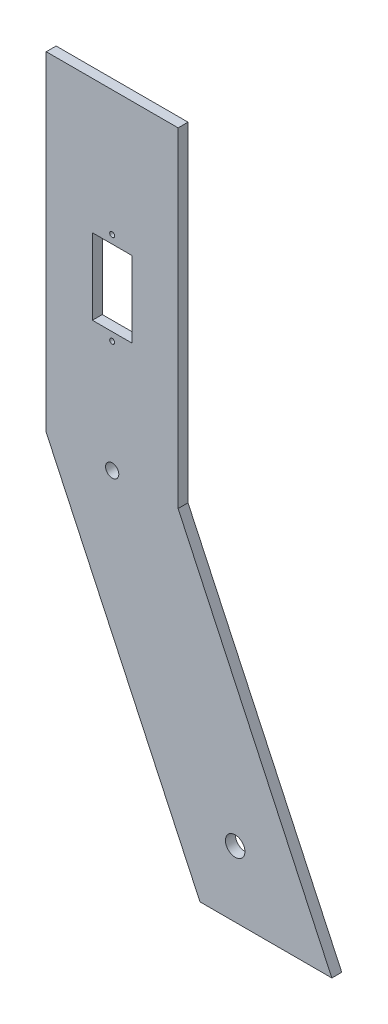
ISO-10303-21;
HEADER;
FILE_DESCRIPTION(('STEP AP214'),'2;1');
FILE_NAME('part.step','',(''),(''),'','','');
FILE_SCHEMA(('AUTOMOTIVE_DESIGN { 1 0 10303 214 1 1 1 1 }'));
ENDSEC;
DATA;
#1=APPLICATION_CONTEXT('core data for automotive mechanical design processes');
#2=APPLICATION_PROTOCOL_DEFINITION('international standard','automotive_design',2000,#1);
#3=PRODUCT_CONTEXT('',#1,'mechanical');
#4=PRODUCT('Part','Part','',(#3));
#5=PRODUCT_RELATED_PRODUCT_CATEGORY('part','',(#4));
#6=PRODUCT_DEFINITION_FORMATION('','',#4);
#7=PRODUCT_DEFINITION_CONTEXT('part definition',#1,'design');
#8=PRODUCT_DEFINITION('design','',#6,#7);
#9=PRODUCT_DEFINITION_SHAPE('','',#8);
#10=(LENGTH_UNIT() NAMED_UNIT(*) SI_UNIT(.MILLI.,.METRE.));
#11=(NAMED_UNIT(*) PLANE_ANGLE_UNIT() SI_UNIT($,.RADIAN.));
#12=(NAMED_UNIT(*) SI_UNIT($,.STERADIAN.) SOLID_ANGLE_UNIT());
#13=UNCERTAINTY_MEASURE_WITH_UNIT(LENGTH_MEASURE(1.E-05),#10,'distance_accuracy_value','');
#14=(GEOMETRIC_REPRESENTATION_CONTEXT(3) GLOBAL_UNCERTAINTY_ASSIGNED_CONTEXT((#13)) GLOBAL_UNIT_ASSIGNED_CONTEXT((#10,
#11,#12)) REPRESENTATION_CONTEXT('',''));
#15=CARTESIAN_POINT('',(0.,0.,0.));
#16=DIRECTION('',(0.,0.,1.));
#17=DIRECTION('',(1.,0.,0.));
#18=AXIS2_PLACEMENT_3D('',#15,#16,#17);
#19=CARTESIAN_POINT('',(0.,0.,3.));
#20=DIRECTION('',(0.,0.,-1.));
#21=DIRECTION('',(-1.,0.,0.));
#22=AXIS2_PLACEMENT_3D('',#19,#20,#21);
#23=PLANE('',#22);
#24=CARTESIAN_POINT('',(-29.3261531631001,20.,3.));
#25=DIRECTION('',(0.,0.,1.));
#26=DIRECTION('',(1.,0.,0.));
#27=AXIS2_PLACEMENT_3D('',#24,#25,#26);
#28=CIRCLE('',#27,2.95);
#29=CARTESIAN_POINT('',(-26.3761531631001,20.,3.));
#30=VERTEX_POINT('',#29);
#31=EDGE_CURVE('E157',#30,#30,#28,.T.);
#32=ORIENTED_EDGE('',*,*,#31,.F.);
#33=EDGE_LOOP('',(#32));
#34=FACE_BOUND('',#33,.T.);
#35=DIRECTION('',(-0.422618261740704,0.906307787036648,0.));
#36=VECTOR('',#35,1.);
#37=CARTESIAN_POINT('',(-46.6307658155005,100.,3.));
#38=LINE('',#37,#36);
#39=CARTESIAN_POINT('',(0.,0.,3.));
#40=VERTEX_POINT('',#39);
#41=CARTESIAN_POINT('',(-46.6307658155005,100.,3.));
#42=VERTEX_POINT('',#41);
#43=EDGE_CURVE('E163',#40,#42,#38,.T.);
#44=ORIENTED_EDGE('',*,*,#43,.T.);
#45=DIRECTION('',(0.,1.,0.));
#46=VECTOR('',#45,1.);
#47=CARTESIAN_POINT('',(-46.6307658155005,200.,3.));
#48=LINE('',#47,#46);
#49=CARTESIAN_POINT('',(-46.6307658155005,200.,3.));
#50=VERTEX_POINT('',#49);
#51=EDGE_CURVE('E166',#42,#50,#48,.T.);
#52=ORIENTED_EDGE('',*,*,#51,.T.);
#53=DIRECTION('',(-1.,0.,0.));
#54=VECTOR('',#53,1.);
#55=CARTESIAN_POINT('',(-86.6307658155005,200.,3.));
#56=LINE('',#55,#54);
#57=CARTESIAN_POINT('',(-86.6307658155005,200.,3.));
#58=VERTEX_POINT('',#57);
#59=EDGE_CURVE('E169',#50,#58,#56,.T.);
#60=ORIENTED_EDGE('',*,*,#59,.T.);
#61=DIRECTION('',(0.,-1.,0.));
#62=VECTOR('',#61,1.);
#63=CARTESIAN_POINT('',(-86.6307658155005,100.,3.));
#64=LINE('',#63,#62);
#65=CARTESIAN_POINT('',(-86.6307658155005,100.,3.));
#66=VERTEX_POINT('',#65);
#67=EDGE_CURVE('E171',#58,#66,#64,.T.);
#68=ORIENTED_EDGE('',*,*,#67,.T.);
#69=DIRECTION('',(0.422618261740704,-0.906307787036648,0.));
#70=VECTOR('',#69,1.);
#71=CARTESIAN_POINT('',(-86.6307658155005,100.,3.));
#72=LINE('',#71,#70);
#73=CARTESIAN_POINT('',(-40.,0.,3.));
#74=VERTEX_POINT('',#73);
#75=EDGE_CURVE('E173',#66,#74,#72,.T.);
#76=ORIENTED_EDGE('',*,*,#75,.T.);
#77=DIRECTION('',(1.,0.,0.));
#78=VECTOR('',#77,1.);
#79=CARTESIAN_POINT('',(0.,0.,3.));
#80=LINE('',#79,#78);
#81=EDGE_CURVE('E175',#74,#40,#80,.T.);
#82=ORIENTED_EDGE('',*,*,#81,.T.);
#83=EDGE_LOOP('',(#44,#52,#60,#68,#76,#82));
#84=FACE_BOUND('',#83,.T.);
#85=DIRECTION('',(0.,-1.,0.));
#86=VECTOR('',#85,1.);
#87=CARTESIAN_POINT('',(-72.6307658155005,159.458067630008,3.));
#88=LINE('',#87,#86);
#89=CARTESIAN_POINT('',(-72.6307658155005,159.458067630008,3.));
#90=VERTEX_POINT('',#89);
#91=CARTESIAN_POINT('',(-72.6307658155005,136.458067630008,3.));
#92=VERTEX_POINT('',#91);
#93=EDGE_CURVE('E118',#90,#92,#88,.T.);
#94=ORIENTED_EDGE('',*,*,#93,.F.);
#95=DIRECTION('',(-1.,0.,0.));
#96=VECTOR('',#95,1.);
#97=CARTESIAN_POINT('',(-60.6307658155005,159.458067630008,3.));
#98=LINE('',#97,#96);
#99=CARTESIAN_POINT('',(-60.6307658155005,159.458067630008,3.));
#100=VERTEX_POINT('',#99);
#101=EDGE_CURVE('E141',#100,#90,#98,.T.);
#102=ORIENTED_EDGE('',*,*,#101,.F.);
#103=DIRECTION('',(0.,1.,0.));
#104=VECTOR('',#103,1.);
#105=CARTESIAN_POINT('',(-60.6307658155005,159.458067630008,3.));
#106=LINE('',#105,#104);
#107=CARTESIAN_POINT('',(-60.6307658155005,136.458067630008,3.));
#108=VERTEX_POINT('',#107);
#109=EDGE_CURVE('E139',#108,#100,#106,.T.);
#110=ORIENTED_EDGE('',*,*,#109,.F.);
#111=DIRECTION('',(1.,0.,0.));
#112=VECTOR('',#111,1.);
#113=CARTESIAN_POINT('',(-72.6307658155005,136.458067630008,3.));
#114=LINE('',#113,#112);
#115=EDGE_CURVE('E126',#92,#108,#114,.T.);
#116=ORIENTED_EDGE('',*,*,#115,.F.);
#117=EDGE_LOOP('',(#94,#102,#110,#116));
#118=FACE_BOUND('',#117,.T.);
#119=CARTESIAN_POINT('',(-66.6307658155005,133.958067630008,3.));
#120=DIRECTION('',(0.,0.,1.));
#121=DIRECTION('',(1.,0.,0.));
#122=AXIS2_PLACEMENT_3D('',#119,#120,#121);
#123=CIRCLE('',#122,0.749999999999999);
#124=CARTESIAN_POINT('',(-65.8807658155005,133.958067630008,3.));
#125=VERTEX_POINT('',#124);
#126=EDGE_CURVE('E147',#125,#125,#123,.T.);
#127=ORIENTED_EDGE('',*,*,#126,.F.);
#128=EDGE_LOOP('',(#127));
#129=FACE_BOUND('',#128,.T.);
#130=CARTESIAN_POINT('',(-66.6307658155005,161.958067630008,3.));
#131=DIRECTION('',(0.,0.,1.));
#132=DIRECTION('',(1.,0.,0.));
#133=AXIS2_PLACEMENT_3D('',#130,#131,#132);
#134=CIRCLE('',#133,0.749999999999999);
#135=CARTESIAN_POINT('',(-65.8807658155005,161.958067630008,3.));
#136=VERTEX_POINT('',#135);
#137=EDGE_CURVE('E287',#136,#136,#134,.T.);
#138=ORIENTED_EDGE('',*,*,#137,.F.);
#139=EDGE_LOOP('',(#138));
#140=FACE_BOUND('',#139,.T.);
#141=CARTESIAN_POINT('',(-66.6307658155005,100.,3.));
#142=DIRECTION('',(0.,0.,1.));
#143=DIRECTION('',(1.,0.,0.));
#144=AXIS2_PLACEMENT_3D('',#141,#142,#143);
#145=CIRCLE('',#144,2.);
#146=CARTESIAN_POINT('',(-64.6307658155005,100.,3.));
#147=VERTEX_POINT('',#146);
#148=EDGE_CURVE('E278',#147,#147,#145,.T.);
#149=ORIENTED_EDGE('',*,*,#148,.F.);
#150=EDGE_LOOP('',(#149));
#151=FACE_BOUND('',#150,.T.);
#152=ADVANCED_FACE('F41',(#34,#84,#118,#129,#140,#151),#23,.F.);
#153=CARTESIAN_POINT('',(0.,0.,0.));
#154=DIRECTION('',(0.,0.,-1.));
#155=DIRECTION('',(-1.,0.,0.));
#156=AXIS2_PLACEMENT_3D('',#153,#154,#155);
#157=PLANE('',#156);
#158=CARTESIAN_POINT('',(-66.6307658155005,161.958067630008,0.));
#159=DIRECTION('',(0.,0.,1.));
#160=DIRECTION('',(1.,0.,0.));
#161=AXIS2_PLACEMENT_3D('',#158,#159,#160);
#162=CIRCLE('',#161,0.749999999999999);
#163=CARTESIAN_POINT('',(-65.8807658155005,161.958067630008,0.));
#164=VERTEX_POINT('',#163);
#165=EDGE_CURVE('E284',#164,#164,#162,.T.);
#166=ORIENTED_EDGE('',*,*,#165,.T.);
#167=EDGE_LOOP('',(#166));
#168=FACE_BOUND('',#167,.T.);
#169=DIRECTION('',(-1.,0.,0.));
#170=VECTOR('',#169,1.);
#171=CARTESIAN_POINT('',(-60.6307658155005,159.458067630008,0.));
#172=LINE('',#171,#170);
#173=CARTESIAN_POINT('',(-60.6307658155005,159.458067630008,0.));
#174=VERTEX_POINT('',#173);
#175=CARTESIAN_POINT('',(-72.6307658155005,159.458067630008,0.));
#176=VERTEX_POINT('',#175);
#177=EDGE_CURVE('E127',#174,#176,#172,.T.);
#178=ORIENTED_EDGE('',*,*,#177,.T.);
#179=DIRECTION('',(0.,-1.,0.));
#180=VECTOR('',#179,1.);
#181=CARTESIAN_POINT('',(-72.6307658155005,159.458067630008,0.));
#182=LINE('',#181,#180);
#183=CARTESIAN_POINT('',(-72.6307658155005,136.458067630008,0.));
#184=VERTEX_POINT('',#183);
#185=EDGE_CURVE('E64',#176,#184,#182,.T.);
#186=ORIENTED_EDGE('',*,*,#185,.T.);
#187=DIRECTION('',(1.,0.,0.));
#188=VECTOR('',#187,1.);
#189=CARTESIAN_POINT('',(-72.6307658155005,136.458067630008,0.));
#190=LINE('',#189,#188);
#191=CARTESIAN_POINT('',(-60.6307658155005,136.458067630008,0.));
#192=VERTEX_POINT('',#191);
#193=EDGE_CURVE('E133',#184,#192,#190,.T.);
#194=ORIENTED_EDGE('',*,*,#193,.T.);
#195=DIRECTION('',(0.,1.,0.));
#196=VECTOR('',#195,1.);
#197=CARTESIAN_POINT('',(-60.6307658155005,159.458067630008,0.));
#198=LINE('',#197,#196);
#199=EDGE_CURVE('E149',#192,#174,#198,.T.);
#200=ORIENTED_EDGE('',*,*,#199,.T.);
#201=EDGE_LOOP('',(#178,#186,#194,#200));
#202=FACE_BOUND('',#201,.T.);
#203=CARTESIAN_POINT('',(-29.3261531631001,20.,0.));
#204=DIRECTION('',(0.,0.,1.));
#205=DIRECTION('',(1.,0.,0.));
#206=AXIS2_PLACEMENT_3D('',#203,#204,#205);
#207=CIRCLE('',#206,2.95);
#208=CARTESIAN_POINT('',(-26.3761531631001,20.,0.));
#209=VERTEX_POINT('',#208);
#210=EDGE_CURVE('E134',#209,#209,#207,.T.);
#211=ORIENTED_EDGE('',*,*,#210,.T.);
#212=EDGE_LOOP('',(#211));
#213=FACE_BOUND('',#212,.T.);
#214=DIRECTION('',(-0.422618261740704,0.906307787036648,0.));
#215=VECTOR('',#214,1.);
#216=CARTESIAN_POINT('',(-46.6307658155005,100.,0.));
#217=LINE('',#216,#215);
#218=CARTESIAN_POINT('',(0.,0.,0.));
#219=VERTEX_POINT('',#218);
#220=CARTESIAN_POINT('',(-46.6307658155005,100.,0.));
#221=VERTEX_POINT('',#220);
#222=EDGE_CURVE('E160',#219,#221,#217,.T.);
#223=ORIENTED_EDGE('',*,*,#222,.F.);
#224=DIRECTION('',(1.,0.,0.));
#225=VECTOR('',#224,1.);
#226=CARTESIAN_POINT('',(0.,0.,0.));
#227=LINE('',#226,#225);
#228=CARTESIAN_POINT('',(-40.,0.,0.));
#229=VERTEX_POINT('',#228);
#230=EDGE_CURVE('E167',#229,#219,#227,.T.);
#231=ORIENTED_EDGE('',*,*,#230,.F.);
#232=DIRECTION('',(0.422618261740704,-0.906307787036648,0.));
#233=VECTOR('',#232,1.);
#234=CARTESIAN_POINT('',(-86.6307658155005,100.,0.));
#235=LINE('',#234,#233);
#236=CARTESIAN_POINT('',(-86.6307658155005,100.,0.));
#237=VERTEX_POINT('',#236);
#238=EDGE_CURVE('E186',#237,#229,#235,.T.);
#239=ORIENTED_EDGE('',*,*,#238,.F.);
#240=DIRECTION('',(0.,-1.,0.));
#241=VECTOR('',#240,1.);
#242=CARTESIAN_POINT('',(-86.6307658155005,100.,0.));
#243=LINE('',#242,#241);
#244=CARTESIAN_POINT('',(-86.6307658155005,200.,0.));
#245=VERTEX_POINT('',#244);
#246=EDGE_CURVE('E184',#245,#237,#243,.T.);
#247=ORIENTED_EDGE('',*,*,#246,.F.);
#248=DIRECTION('',(-1.,0.,0.));
#249=VECTOR('',#248,1.);
#250=CARTESIAN_POINT('',(-86.6307658155005,200.,0.));
#251=LINE('',#250,#249);
#252=CARTESIAN_POINT('',(-46.6307658155005,200.,0.));
#253=VERTEX_POINT('',#252);
#254=EDGE_CURVE('E182',#253,#245,#251,.T.);
#255=ORIENTED_EDGE('',*,*,#254,.F.);
#256=DIRECTION('',(0.,1.,0.));
#257=VECTOR('',#256,1.);
#258=CARTESIAN_POINT('',(-46.6307658155005,200.,0.));
#259=LINE('',#258,#257);
#260=EDGE_CURVE('E180',#221,#253,#259,.T.);
#261=ORIENTED_EDGE('',*,*,#260,.F.);
#262=EDGE_LOOP('',(#223,#231,#239,#247,#255,#261));
#263=FACE_BOUND('',#262,.T.);
#264=CARTESIAN_POINT('',(-66.6307658155005,133.958067630008,0.));
#265=DIRECTION('',(0.,0.,1.));
#266=DIRECTION('',(1.,0.,0.));
#267=AXIS2_PLACEMENT_3D('',#264,#265,#266);
#268=CIRCLE('',#267,0.749999999999999);
#269=CARTESIAN_POINT('',(-65.8807658155005,133.958067630008,0.));
#270=VERTEX_POINT('',#269);
#271=EDGE_CURVE('E290',#270,#270,#268,.T.);
#272=ORIENTED_EDGE('',*,*,#271,.T.);
#273=EDGE_LOOP('',(#272));
#274=FACE_BOUND('',#273,.T.);
#275=CARTESIAN_POINT('',(-66.6307658155005,100.,0.));
#276=DIRECTION('',(0.,0.,1.));
#277=DIRECTION('',(1.,0.,0.));
#278=AXIS2_PLACEMENT_3D('',#275,#276,#277);
#279=CIRCLE('',#278,2.);
#280=CARTESIAN_POINT('',(-64.6307658155005,100.,0.));
#281=VERTEX_POINT('',#280);
#282=EDGE_CURVE('E281',#281,#281,#279,.T.);
#283=ORIENTED_EDGE('',*,*,#282,.T.);
#284=EDGE_LOOP('',(#283));
#285=FACE_BOUND('',#284,.T.);
#286=ADVANCED_FACE('F210',(#168,#202,#213,#263,#274,#285),#157,.T.);
#287=CARTESIAN_POINT('',(-46.6307658155005,100.,3.));
#288=DIRECTION('',(-0.906307787036648,-0.422618261740704,0.));
#289=DIRECTION('',(0.422618261740704,-0.906307787036648,0.));
#290=AXIS2_PLACEMENT_3D('',#287,#288,#289);
#291=PLANE('',#290);
#292=ORIENTED_EDGE('',*,*,#222,.T.);
#293=DIRECTION('',(0.,0.,-1.));
#294=VECTOR('',#293,1.);
#295=CARTESIAN_POINT('',(-46.6307658155005,100.,3.));
#296=LINE('',#295,#294);
#297=EDGE_CURVE('E11',#42,#221,#296,.T.);
#298=ORIENTED_EDGE('',*,*,#297,.F.);
#299=ORIENTED_EDGE('',*,*,#43,.F.);
#300=DIRECTION('',(0.,0.,-1.));
#301=VECTOR('',#300,1.);
#302=CARTESIAN_POINT('',(0.,0.,3.));
#303=LINE('',#302,#301);
#304=EDGE_CURVE('E177',#40,#219,#303,.T.);
#305=ORIENTED_EDGE('',*,*,#304,.T.);
#306=EDGE_LOOP('',(#292,#298,#299,#305));
#307=FACE_BOUND('',#306,.T.);
#308=ADVANCED_FACE('F43',(#307),#291,.F.);
#309=CARTESIAN_POINT('',(-46.6307658155005,200.,3.));
#310=DIRECTION('',(-1.,0.,0.));
#311=DIRECTION('',(0.,-1.,0.));
#312=AXIS2_PLACEMENT_3D('',#309,#310,#311);
#313=PLANE('',#312);
#314=ORIENTED_EDGE('',*,*,#260,.T.);
#315=DIRECTION('',(0.,0.,-1.));
#316=VECTOR('',#315,1.);
#317=CARTESIAN_POINT('',(-46.6307658155005,200.,3.));
#318=LINE('',#317,#316);
#319=EDGE_CURVE('E49',#50,#253,#318,.T.);
#320=ORIENTED_EDGE('',*,*,#319,.F.);
#321=ORIENTED_EDGE('',*,*,#51,.F.);
#322=ORIENTED_EDGE('',*,*,#297,.T.);
#323=EDGE_LOOP('',(#314,#320,#321,#322));
#324=FACE_BOUND('',#323,.T.);
#325=ADVANCED_FACE('F227',(#324),#313,.F.);
#326=CARTESIAN_POINT('',(-86.6307658155005,200.,3.));
#327=DIRECTION('',(0.,-1.,0.));
#328=DIRECTION('',(0.,0.,-1.));
#329=AXIS2_PLACEMENT_3D('',#326,#327,#328);
#330=PLANE('',#329);
#331=ORIENTED_EDGE('',*,*,#254,.T.);
#332=DIRECTION('',(0.,0.,-1.));
#333=VECTOR('',#332,1.);
#334=CARTESIAN_POINT('',(-86.6307658155005,200.,3.));
#335=LINE('',#334,#333);
#336=EDGE_CURVE('E197',#58,#245,#335,.T.);
#337=ORIENTED_EDGE('',*,*,#336,.F.);
#338=ORIENTED_EDGE('',*,*,#59,.F.);
#339=ORIENTED_EDGE('',*,*,#319,.T.);
#340=EDGE_LOOP('',(#331,#337,#338,#339));
#341=FACE_BOUND('',#340,.T.);
#342=ADVANCED_FACE('F204',(#341),#330,.F.);
#343=CARTESIAN_POINT('',(-86.6307658155005,100.,3.));
#344=DIRECTION('',(1.,0.,0.));
#345=DIRECTION('',(0.,1.,0.));
#346=AXIS2_PLACEMENT_3D('',#343,#344,#345);
#347=PLANE('',#346);
#348=ORIENTED_EDGE('',*,*,#246,.T.);
#349=DIRECTION('',(0.,0.,-1.));
#350=VECTOR('',#349,1.);
#351=CARTESIAN_POINT('',(-86.6307658155005,100.,3.));
#352=LINE('',#351,#350);
#353=EDGE_CURVE('E194',#66,#237,#352,.T.);
#354=ORIENTED_EDGE('',*,*,#353,.F.);
#355=ORIENTED_EDGE('',*,*,#67,.F.);
#356=ORIENTED_EDGE('',*,*,#336,.T.);
#357=EDGE_LOOP('',(#348,#354,#355,#356));
#358=FACE_BOUND('',#357,.T.);
#359=ADVANCED_FACE('F216',(#358),#347,.F.);
#360=CARTESIAN_POINT('',(-86.6307658155005,100.,3.));
#361=DIRECTION('',(0.906307787036648,0.422618261740704,0.));
#362=DIRECTION('',(-0.422618261740704,0.906307787036648,0.));
#363=AXIS2_PLACEMENT_3D('',#360,#361,#362);
#364=PLANE('',#363);
#365=ORIENTED_EDGE('',*,*,#238,.T.);
#366=DIRECTION('',(0.,0.,-1.));
#367=VECTOR('',#366,1.);
#368=CARTESIAN_POINT('',(-40.,0.,3.));
#369=LINE('',#368,#367);
#370=EDGE_CURVE('E191',#74,#229,#369,.T.);
#371=ORIENTED_EDGE('',*,*,#370,.F.);
#372=ORIENTED_EDGE('',*,*,#75,.F.);
#373=ORIENTED_EDGE('',*,*,#353,.T.);
#374=EDGE_LOOP('',(#365,#371,#372,#373));
#375=FACE_BOUND('',#374,.T.);
#376=ADVANCED_FACE('F220',(#375),#364,.F.);
#377=CARTESIAN_POINT('',(0.,0.,3.));
#378=DIRECTION('',(0.,1.,0.));
#379=DIRECTION('',(-1.,0.,0.));
#380=AXIS2_PLACEMENT_3D('',#377,#378,#379);
#381=PLANE('',#380);
#382=ORIENTED_EDGE('',*,*,#230,.T.);
#383=ORIENTED_EDGE('',*,*,#304,.F.);
#384=ORIENTED_EDGE('',*,*,#81,.F.);
#385=ORIENTED_EDGE('',*,*,#370,.T.);
#386=EDGE_LOOP('',(#382,#383,#384,#385));
#387=FACE_BOUND('',#386,.T.);
#388=ADVANCED_FACE('F230',(#387),#381,.F.);
#389=CARTESIAN_POINT('',(-29.3261531631001,20.,3.));
#390=DIRECTION('',(0.,0.,-1.));
#391=DIRECTION('',(-1.,0.,0.));
#392=AXIS2_PLACEMENT_3D('',#389,#390,#391);
#393=CYLINDRICAL_SURFACE('',#392,2.95);
#394=ORIENTED_EDGE('',*,*,#31,.T.);
#395=EDGE_LOOP('',(#394));
#396=FACE_BOUND('',#395,.T.);
#397=ORIENTED_EDGE('',*,*,#210,.F.);
#398=EDGE_LOOP('',(#397));
#399=FACE_BOUND('',#398,.T.);
#400=ADVANCED_FACE('F232',(#396,#399),#393,.F.);
#401=CARTESIAN_POINT('',(-72.6307658155005,159.458067630008,3.));
#402=DIRECTION('',(1.,0.,0.));
#403=DIRECTION('',(0.,0.,-1.));
#404=AXIS2_PLACEMENT_3D('',#401,#402,#403);
#405=PLANE('',#404);
#406=ORIENTED_EDGE('',*,*,#185,.F.);
#407=DIRECTION('',(0.,0.,-1.));
#408=VECTOR('',#407,1.);
#409=CARTESIAN_POINT('',(-72.6307658155005,159.458067630008,3.));
#410=LINE('',#409,#408);
#411=EDGE_CURVE('E122',#90,#176,#410,.T.);
#412=ORIENTED_EDGE('',*,*,#411,.F.);
#413=ORIENTED_EDGE('',*,*,#93,.T.);
#414=DIRECTION('',(0.,0.,-1.));
#415=VECTOR('',#414,1.);
#416=CARTESIAN_POINT('',(-72.6307658155005,136.458067630008,3.));
#417=LINE('',#416,#415);
#418=EDGE_CURVE('E121',#92,#184,#417,.T.);
#419=ORIENTED_EDGE('',*,*,#418,.T.);
#420=EDGE_LOOP('',(#406,#412,#413,#419));
#421=FACE_BOUND('',#420,.T.);
#422=ADVANCED_FACE('F120',(#421),#405,.T.);
#423=CARTESIAN_POINT('',(-72.6307658155005,136.458067630008,3.));
#424=DIRECTION('',(0.,1.,0.));
#425=DIRECTION('',(0.,0.,1.));
#426=AXIS2_PLACEMENT_3D('',#423,#424,#425);
#427=PLANE('',#426);
#428=ORIENTED_EDGE('',*,*,#193,.F.);
#429=ORIENTED_EDGE('',*,*,#418,.F.);
#430=ORIENTED_EDGE('',*,*,#115,.T.);
#431=DIRECTION('',(0.,0.,-1.));
#432=VECTOR('',#431,1.);
#433=CARTESIAN_POINT('',(-60.6307658155005,136.458067630008,3.));
#434=LINE('',#433,#432);
#435=EDGE_CURVE('E135',#108,#192,#434,.T.);
#436=ORIENTED_EDGE('',*,*,#435,.T.);
#437=EDGE_LOOP('',(#428,#429,#430,#436));
#438=FACE_BOUND('',#437,.T.);
#439=ADVANCED_FACE('F130',(#438),#427,.T.);
#440=CARTESIAN_POINT('',(-60.6307658155005,159.458067630008,3.));
#441=DIRECTION('',(-1.,0.,0.));
#442=DIRECTION('',(0.,-1.,0.));
#443=AXIS2_PLACEMENT_3D('',#440,#441,#442);
#444=PLANE('',#443);
#445=ORIENTED_EDGE('',*,*,#199,.F.);
#446=ORIENTED_EDGE('',*,*,#435,.F.);
#447=ORIENTED_EDGE('',*,*,#109,.T.);
#448=DIRECTION('',(0.,0.,-1.));
#449=VECTOR('',#448,1.);
#450=CARTESIAN_POINT('',(-60.6307658155005,159.458067630008,3.));
#451=LINE('',#450,#449);
#452=EDGE_CURVE('E56',#100,#174,#451,.T.);
#453=ORIENTED_EDGE('',*,*,#452,.T.);
#454=EDGE_LOOP('',(#445,#446,#447,#453));
#455=FACE_BOUND('',#454,.T.);
#456=ADVANCED_FACE('F255',(#455),#444,.T.);
#457=CARTESIAN_POINT('',(-60.6307658155005,159.458067630008,3.));
#458=DIRECTION('',(0.,-1.,0.));
#459=DIRECTION('',(0.,0.,-1.));
#460=AXIS2_PLACEMENT_3D('',#457,#458,#459);
#461=PLANE('',#460);
#462=ORIENTED_EDGE('',*,*,#177,.F.);
#463=ORIENTED_EDGE('',*,*,#452,.F.);
#464=ORIENTED_EDGE('',*,*,#101,.T.);
#465=ORIENTED_EDGE('',*,*,#411,.T.);
#466=EDGE_LOOP('',(#462,#463,#464,#465));
#467=FACE_BOUND('',#466,.T.);
#468=ADVANCED_FACE('F258',(#467),#461,.T.);
#469=CARTESIAN_POINT('',(-66.6307658155005,133.958067630008,3.));
#470=DIRECTION('',(0.,0.,-1.));
#471=DIRECTION('',(-1.,0.,0.));
#472=AXIS2_PLACEMENT_3D('',#469,#470,#471);
#473=CYLINDRICAL_SURFACE('',#472,0.749999999999999);
#474=ORIENTED_EDGE('',*,*,#126,.T.);
#475=EDGE_LOOP('',(#474));
#476=FACE_BOUND('',#475,.T.);
#477=ORIENTED_EDGE('',*,*,#271,.F.);
#478=EDGE_LOOP('',(#477));
#479=FACE_BOUND('',#478,.T.);
#480=ADVANCED_FACE('F262',(#476,#479),#473,.F.);
#481=CARTESIAN_POINT('',(-66.6307658155005,161.958067630008,3.));
#482=DIRECTION('',(0.,0.,-1.));
#483=DIRECTION('',(-1.,0.,0.));
#484=AXIS2_PLACEMENT_3D('',#481,#482,#483);
#485=CYLINDRICAL_SURFACE('',#484,0.749999999999999);
#486=ORIENTED_EDGE('',*,*,#137,.T.);
#487=EDGE_LOOP('',(#486));
#488=FACE_BOUND('',#487,.T.);
#489=ORIENTED_EDGE('',*,*,#165,.F.);
#490=EDGE_LOOP('',(#489));
#491=FACE_BOUND('',#490,.T.);
#492=ADVANCED_FACE('F265',(#488,#491),#485,.F.);
#493=CARTESIAN_POINT('',(-66.6307658155005,100.,3.));
#494=DIRECTION('',(0.,0.,-1.));
#495=DIRECTION('',(-1.,0.,0.));
#496=AXIS2_PLACEMENT_3D('',#493,#494,#495);
#497=CYLINDRICAL_SURFACE('',#496,2.);
#498=ORIENTED_EDGE('',*,*,#148,.T.);
#499=EDGE_LOOP('',(#498));
#500=FACE_BOUND('',#499,.T.);
#501=ORIENTED_EDGE('',*,*,#282,.F.);
#502=EDGE_LOOP('',(#501));
#503=FACE_BOUND('',#502,.T.);
#504=ADVANCED_FACE('F269',(#500,#503),#497,.F.);
#505=CLOSED_SHELL('',(#152,#286,#308,#325,#342,#359,#376,#388,#400,#422,#439,#456,#468,#480,
#492,#504));
#506=MANIFOLD_SOLID_BREP('B2',#505);
#507=ADVANCED_BREP_SHAPE_REPRESENTATION('',(#18,#506),#14);
#508=SHAPE_DEFINITION_REPRESENTATION(#9,#507);
ENDSEC;
END-ISO-10303-21;
